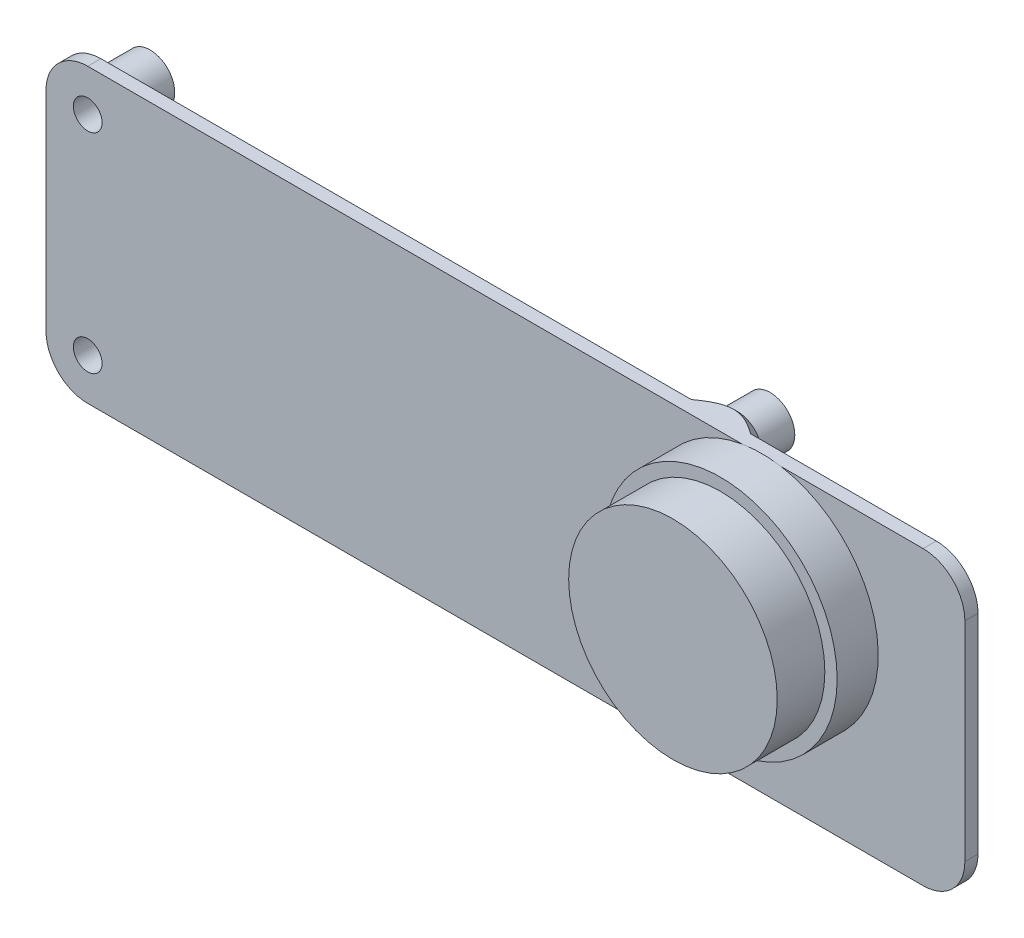
ISO-10303-21;
HEADER;
FILE_DESCRIPTION(('STEP AP214'),'2;1');
FILE_NAME('part.step','',(''),(''),'','','');
FILE_SCHEMA(('AUTOMOTIVE_DESIGN { 1 0 10303 214 1 1 1 1 }'));
ENDSEC;
DATA;
#1=APPLICATION_CONTEXT('core data for automotive mechanical design processes');
#2=APPLICATION_PROTOCOL_DEFINITION('international standard','automotive_design',2000,#1);
#3=PRODUCT_CONTEXT('',#1,'mechanical');
#4=PRODUCT('Part','Part','',(#3));
#5=PRODUCT_RELATED_PRODUCT_CATEGORY('part','',(#4));
#6=PRODUCT_DEFINITION_FORMATION('','',#4);
#7=PRODUCT_DEFINITION_CONTEXT('part definition',#1,'design');
#8=PRODUCT_DEFINITION('design','',#6,#7);
#9=PRODUCT_DEFINITION_SHAPE('','',#8);
#10=(LENGTH_UNIT() NAMED_UNIT(*) SI_UNIT(.MILLI.,.METRE.));
#11=(NAMED_UNIT(*) PLANE_ANGLE_UNIT() SI_UNIT($,.RADIAN.));
#12=(NAMED_UNIT(*) SI_UNIT($,.STERADIAN.) SOLID_ANGLE_UNIT());
#13=UNCERTAINTY_MEASURE_WITH_UNIT(LENGTH_MEASURE(1.E-05),#10,'distance_accuracy_value','');
#14=(GEOMETRIC_REPRESENTATION_CONTEXT(3) GLOBAL_UNCERTAINTY_ASSIGNED_CONTEXT((#13)) GLOBAL_UNIT_ASSIGNED_CONTEXT((#10,
#11,#12)) REPRESENTATION_CONTEXT('',''));
#15=CARTESIAN_POINT('',(0.,0.,0.));
#16=DIRECTION('',(0.,0.,1.));
#17=DIRECTION('',(1.,0.,0.));
#18=AXIS2_PLACEMENT_3D('',#15,#16,#17);
#19=CARTESIAN_POINT('',(0.,-25.4,1.6));
#20=DIRECTION('',(0.,0.,1.));
#21=DIRECTION('',(1.,0.,0.));
#22=AXIS2_PLACEMENT_3D('',#19,#20,#21);
#23=PLANE('',#22);
#24=CARTESIAN_POINT('',(64.33,-27.48,1.6));
#25=DIRECTION('',(0.,0.,1.));
#26=DIRECTION('',(1.,0.,0.));
#27=AXIS2_PLACEMENT_3D('',#24,#25,#26);
#28=CIRCLE('',#27,1.75);
#29=CARTESIAN_POINT('',(66.08,-27.48,1.6));
#30=VERTEX_POINT('',#29);
#31=EDGE_CURVE('E187',#30,#30,#28,.T.);
#32=ORIENTED_EDGE('',*,*,#31,.F.);
#33=EDGE_LOOP('',(#32));
#34=FACE_BOUND('',#33,.T.);
#35=CARTESIAN_POINT('',(0.,-25.4,1.6));
#36=DIRECTION('',(0.,0.,1.));
#37=DIRECTION('',(1.,0.,0.));
#38=AXIS2_PLACEMENT_3D('',#35,#36,#37);
#39=CIRCLE('',#38,1.75);
#40=CARTESIAN_POINT('',(1.75,-25.4,1.6));
#41=VERTEX_POINT('',#40);
#42=EDGE_CURVE('E193',#41,#41,#39,.T.);
#43=ORIENTED_EDGE('',*,*,#42,.F.);
#44=EDGE_LOOP('',(#43));
#45=FACE_BOUND('',#44,.T.);
#46=CARTESIAN_POINT('',(0.,0.,1.6));
#47=DIRECTION('',(0.,0.,1.));
#48=DIRECTION('',(1.,0.,0.));
#49=AXIS2_PLACEMENT_3D('',#46,#47,#48);
#50=CIRCLE('',#49,1.75);
#51=CARTESIAN_POINT('',(1.75,0.,1.6));
#52=VERTEX_POINT('',#51);
#53=EDGE_CURVE('E196',#52,#52,#50,.T.);
#54=ORIENTED_EDGE('',*,*,#53,.F.);
#55=EDGE_LOOP('',(#54));
#56=FACE_BOUND('',#55,.T.);
#57=DIRECTION('',(-1.,0.,0.));
#58=VECTOR('',#57,1.);
#59=CARTESIAN_POINT('',(0.,5.08,1.6));
#60=LINE('',#59,#58);
#61=CARTESIAN_POINT('',(101.74,5.08,1.6));
#62=VERTEX_POINT('',#61);
#63=CARTESIAN_POINT('',(84.4448684174076,5.08,1.6));
#64=VERTEX_POINT('',#63);
#65=EDGE_CURVE('E140',#62,#64,#60,.T.);
#66=ORIENTED_EDGE('',*,*,#65,.T.);
#67=CARTESIAN_POINT('',(82.07,-8.92,1.6));
#68=DIRECTION('',(0.,0.,1.));
#69=DIRECTION('',(1.,0.,0.));
#70=AXIS2_PLACEMENT_3D('',#67,#68,#69);
#71=CIRCLE('',#70,14.2);
#72=CARTESIAN_POINT('',(79.6951315825924,5.08,1.6));
#73=VERTEX_POINT('',#72);
#74=EDGE_CURVE('E144',#73,#64,#71,.T.);
#75=ORIENTED_EDGE('',*,*,#74,.F.);
#76=CARTESIAN_POINT('',(0.,5.08,1.6));
#77=VERTEX_POINT('',#76);
#78=EDGE_CURVE('E129',#73,#77,#60,.T.);
#79=ORIENTED_EDGE('',*,*,#78,.T.);
#80=CARTESIAN_POINT('',(0.,0.,1.6));
#81=DIRECTION('',(0.,0.,1.));
#82=DIRECTION('',(1.,0.,0.));
#83=AXIS2_PLACEMENT_3D('',#80,#81,#82);
#84=CIRCLE('',#83,5.08);
#85=CARTESIAN_POINT('',(-5.08,0.,1.6));
#86=VERTEX_POINT('',#85);
#87=EDGE_CURVE('E211',#77,#86,#84,.T.);
#88=ORIENTED_EDGE('',*,*,#87,.T.);
#89=DIRECTION('',(0.,-1.,0.));
#90=VECTOR('',#89,1.);
#91=CARTESIAN_POINT('',(-5.08,0.,1.6));
#92=LINE('',#91,#90);
#93=CARTESIAN_POINT('',(-5.08,-25.4,1.6));
#94=VERTEX_POINT('',#93);
#95=EDGE_CURVE('E213',#86,#94,#92,.T.);
#96=ORIENTED_EDGE('',*,*,#95,.T.);
#97=CARTESIAN_POINT('',(0.,-25.4,1.6));
#98=DIRECTION('',(0.,0.,1.));
#99=DIRECTION('',(1.,0.,0.));
#100=AXIS2_PLACEMENT_3D('',#97,#98,#99);
#101=CIRCLE('',#100,5.08);
#102=CARTESIAN_POINT('',(0.,-30.48,1.6));
#103=VERTEX_POINT('',#102);
#104=EDGE_CURVE('E200',#94,#103,#101,.T.);
#105=ORIENTED_EDGE('',*,*,#104,.T.);
#106=DIRECTION('',(1.,0.,0.));
#107=VECTOR('',#106,1.);
#108=CARTESIAN_POINT('',(0.,-30.48,1.6));
#109=LINE('',#108,#107);
#110=CARTESIAN_POINT('',(101.74,-30.48,1.6));
#111=VERTEX_POINT('',#110);
#112=EDGE_CURVE('E203',#103,#111,#109,.T.);
#113=ORIENTED_EDGE('',*,*,#112,.T.);
#114=CARTESIAN_POINT('',(101.74,-25.4,1.6));
#115=DIRECTION('',(0.,0.,1.));
#116=DIRECTION('',(1.,0.,0.));
#117=AXIS2_PLACEMENT_3D('',#114,#115,#116);
#118=CIRCLE('',#117,5.08);
#119=CARTESIAN_POINT('',(106.82,-25.4,1.6));
#120=VERTEX_POINT('',#119);
#121=EDGE_CURVE('E206',#111,#120,#118,.T.);
#122=ORIENTED_EDGE('',*,*,#121,.T.);
#123=DIRECTION('',(0.,1.,0.));
#124=VECTOR('',#123,1.);
#125=CARTESIAN_POINT('',(106.82,0.,1.6));
#126=LINE('',#125,#124);
#127=CARTESIAN_POINT('',(106.82,0.,1.6));
#128=VERTEX_POINT('',#127);
#129=EDGE_CURVE('E208',#120,#128,#126,.T.);
#130=ORIENTED_EDGE('',*,*,#129,.T.);
#131=CARTESIAN_POINT('',(101.74,0.,1.6));
#132=DIRECTION('',(0.,0.,1.));
#133=DIRECTION('',(-1.,0.,0.));
#134=AXIS2_PLACEMENT_3D('',#131,#132,#133);
#135=CIRCLE('',#134,5.08);
#136=EDGE_CURVE('E141',#128,#62,#135,.T.);
#137=ORIENTED_EDGE('',*,*,#136,.T.);
#138=EDGE_LOOP('',(#66,#75,#79,#88,#96,#105,#113,#122,#130,#137));
#139=FACE_BOUND('',#138,.T.);
#140=ADVANCED_FACE('F41',(#34,#45,#56,#139),#23,.T.);
#141=CARTESIAN_POINT('',(0.,-25.4,0.));
#142=DIRECTION('',(0.,0.,1.));
#143=DIRECTION('',(1.,0.,0.));
#144=AXIS2_PLACEMENT_3D('',#141,#142,#143);
#145=PLANE('',#144);
#146=CARTESIAN_POINT('',(0.,-25.4,0.));
#147=DIRECTION('',(0.,0.,1.));
#148=DIRECTION('',(1.,0.,0.));
#149=AXIS2_PLACEMENT_3D('',#146,#147,#148);
#150=CIRCLE('',#149,4.99999999999999);
#151=CARTESIAN_POINT('',(4.99999999999999,-25.4,0.));
#152=VERTEX_POINT('',#151);
#153=EDGE_CURVE('E263',#152,#152,#150,.T.);
#154=ORIENTED_EDGE('',*,*,#153,.T.);
#155=EDGE_LOOP('',(#154));
#156=FACE_BOUND('',#155,.T.);
#157=CARTESIAN_POINT('',(0.,0.,0.));
#158=DIRECTION('',(0.,0.,1.));
#159=DIRECTION('',(1.,0.,0.));
#160=AXIS2_PLACEMENT_3D('',#157,#158,#159);
#161=CIRCLE('',#160,5.);
#162=CARTESIAN_POINT('',(5.,0.,0.));
#163=VERTEX_POINT('',#162);
#164=EDGE_CURVE('E260',#163,#163,#161,.T.);
#165=ORIENTED_EDGE('',*,*,#164,.T.);
#166=EDGE_LOOP('',(#165));
#167=FACE_BOUND('',#166,.T.);
#168=DIRECTION('',(1.,0.,0.));
#169=VECTOR('',#168,1.);
#170=CARTESIAN_POINT('',(0.,-30.48,0.));
#171=LINE('',#170,#169);
#172=CARTESIAN_POINT('',(68.33,-30.48,0.));
#173=VERTEX_POINT('',#172);
#174=CARTESIAN_POINT('',(101.74,-30.48,0.));
#175=VERTEX_POINT('',#174);
#176=EDGE_CURVE('E218',#173,#175,#171,.T.);
#177=ORIENTED_EDGE('',*,*,#176,.F.);
#178=CARTESIAN_POINT('',(64.33,-27.48,0.));
#179=DIRECTION('',(0.,0.,1.));
#180=DIRECTION('',(1.,0.,0.));
#181=AXIS2_PLACEMENT_3D('',#178,#179,#180);
#182=CIRCLE('',#181,4.99999999999999);
#183=CARTESIAN_POINT('',(60.33,-30.48,0.));
#184=VERTEX_POINT('',#183);
#185=EDGE_CURVE('E266',#173,#184,#182,.T.);
#186=ORIENTED_EDGE('',*,*,#185,.T.);
#187=CARTESIAN_POINT('',(0.,-30.48,0.));
#188=VERTEX_POINT('',#187);
#189=EDGE_CURVE('E219',#188,#184,#171,.T.);
#190=ORIENTED_EDGE('',*,*,#189,.F.);
#191=CARTESIAN_POINT('',(0.,-25.4,0.));
#192=DIRECTION('',(0.,0.,1.));
#193=DIRECTION('',(1.,0.,0.));
#194=AXIS2_PLACEMENT_3D('',#191,#192,#193);
#195=CIRCLE('',#194,5.08);
#196=CARTESIAN_POINT('',(-5.08,-25.4,0.));
#197=VERTEX_POINT('',#196);
#198=EDGE_CURVE('E199',#197,#188,#195,.T.);
#199=ORIENTED_EDGE('',*,*,#198,.F.);
#200=DIRECTION('',(0.,-1.,0.));
#201=VECTOR('',#200,1.);
#202=CARTESIAN_POINT('',(-5.08,0.,0.));
#203=LINE('',#202,#201);
#204=CARTESIAN_POINT('',(-5.08,0.,0.));
#205=VERTEX_POINT('',#204);
#206=EDGE_CURVE('E204',#205,#197,#203,.T.);
#207=ORIENTED_EDGE('',*,*,#206,.F.);
#208=CARTESIAN_POINT('',(0.,0.,0.));
#209=DIRECTION('',(0.,0.,1.));
#210=DIRECTION('',(1.,0.,0.));
#211=AXIS2_PLACEMENT_3D('',#208,#209,#210);
#212=CIRCLE('',#211,5.08);
#213=CARTESIAN_POINT('',(0.,5.08,0.));
#214=VERTEX_POINT('',#213);
#215=EDGE_CURVE('E230',#214,#205,#212,.T.);
#216=ORIENTED_EDGE('',*,*,#215,.F.);
#217=DIRECTION('',(-1.,0.,0.));
#218=VECTOR('',#217,1.);
#219=CARTESIAN_POINT('',(0.,5.08,0.));
#220=LINE('',#219,#218);
#221=CARTESIAN_POINT('',(71.8909531641605,5.08,0.));
#222=VERTEX_POINT('',#221);
#223=EDGE_CURVE('E227',#222,#214,#220,.T.);
#224=ORIENTED_EDGE('',*,*,#223,.F.);
#225=CARTESIAN_POINT('',(75.51,1.63,0.));
#226=DIRECTION('',(0.,0.,1.));
#227=DIRECTION('',(1.,0.,0.));
#228=AXIS2_PLACEMENT_3D('',#225,#226,#227);
#229=CIRCLE('',#228,4.99999999999999);
#230=CARTESIAN_POINT('',(79.1290468358395,5.08,0.));
#231=VERTEX_POINT('',#230);
#232=EDGE_CURVE('E257',#222,#231,#229,.T.);
#233=ORIENTED_EDGE('',*,*,#232,.T.);
#234=CARTESIAN_POINT('',(101.74,5.08,0.));
#235=VERTEX_POINT('',#234);
#236=EDGE_CURVE('E228',#235,#231,#220,.T.);
#237=ORIENTED_EDGE('',*,*,#236,.F.);
#238=CARTESIAN_POINT('',(101.74,0.,0.));
#239=DIRECTION('',(0.,0.,1.));
#240=DIRECTION('',(-1.,0.,0.));
#241=AXIS2_PLACEMENT_3D('',#238,#239,#240);
#242=CIRCLE('',#241,5.08);
#243=CARTESIAN_POINT('',(106.82,0.,0.));
#244=VERTEX_POINT('',#243);
#245=EDGE_CURVE('E225',#244,#235,#242,.T.);
#246=ORIENTED_EDGE('',*,*,#245,.F.);
#247=DIRECTION('',(0.,1.,0.));
#248=VECTOR('',#247,1.);
#249=CARTESIAN_POINT('',(106.82,0.,0.));
#250=LINE('',#249,#248);
#251=CARTESIAN_POINT('',(106.82,-25.4,0.));
#252=VERTEX_POINT('',#251);
#253=EDGE_CURVE('E223',#252,#244,#250,.T.);
#254=ORIENTED_EDGE('',*,*,#253,.F.);
#255=CARTESIAN_POINT('',(101.74,-25.4,0.));
#256=DIRECTION('',(0.,0.,1.));
#257=DIRECTION('',(1.,0.,0.));
#258=AXIS2_PLACEMENT_3D('',#255,#256,#257);
#259=CIRCLE('',#258,5.08);
#260=EDGE_CURVE('E221',#175,#252,#259,.T.);
#261=ORIENTED_EDGE('',*,*,#260,.F.);
#262=EDGE_LOOP('',(#177,#186,#190,#199,#207,#216,#224,#233,#237,#246,#254,#261));
#263=FACE_BOUND('',#262,.T.);
#264=ADVANCED_FACE('F323',(#156,#167,#263),#145,.F.);
#265=CARTESIAN_POINT('',(0.,-25.4,1.6));
#266=DIRECTION('',(0.,0.,-1.));
#267=DIRECTION('',(-1.,0.,0.));
#268=AXIS2_PLACEMENT_3D('',#265,#266,#267);
#269=CYLINDRICAL_SURFACE('',#268,5.08);
#270=ORIENTED_EDGE('',*,*,#198,.T.);
#271=DIRECTION('',(0.,0.,-1.));
#272=VECTOR('',#271,1.);
#273=CARTESIAN_POINT('',(0.,-30.48,1.6));
#274=LINE('',#273,#272);
#275=EDGE_CURVE('E251',#103,#188,#274,.T.);
#276=ORIENTED_EDGE('',*,*,#275,.F.);
#277=ORIENTED_EDGE('',*,*,#104,.F.);
#278=DIRECTION('',(0.,0.,-1.));
#279=VECTOR('',#278,1.);
#280=CARTESIAN_POINT('',(-5.08,-25.4,1.6));
#281=LINE('',#280,#279);
#282=EDGE_CURVE('E215',#94,#197,#281,.T.);
#283=ORIENTED_EDGE('',*,*,#282,.T.);
#284=EDGE_LOOP('',(#270,#276,#277,#283));
#285=FACE_BOUND('',#284,.T.);
#286=ADVANCED_FACE('F304',(#285),#269,.T.);
#287=CARTESIAN_POINT('',(0.,-30.48,1.6));
#288=DIRECTION('',(0.,1.,0.));
#289=DIRECTION('',(0.,0.,1.));
#290=AXIS2_PLACEMENT_3D('',#287,#288,#289);
#291=PLANE('',#290);
#292=ORIENTED_EDGE('',*,*,#189,.T.);
#293=CARTESIAN_POINT('',(60.33,-30.48,0.));
#294=CARTESIAN_POINT('',(60.4042045666358,-30.48,-0.0593600465069753));
#295=CARTESIAN_POINT('',(60.4786951441885,-30.48,-0.118362128846301));
#296=CARTESIAN_POINT('',(60.6283359131911,-30.48,-0.235532965714645));
#297=CARTESIAN_POINT('',(60.7034861450909,-30.48,-0.293701668556894));
#298=CARTESIAN_POINT('',(60.9303044347763,-30.48,-0.466969643006251));
#299=CARTESIAN_POINT('',(61.0830846810868,-30.48,-0.580625166081469));
#300=CARTESIAN_POINT('',(61.3978855060882,-30.48,-0.806570760726502));
#301=CARTESIAN_POINT('',(61.5600421027586,-30.48,-0.91867231134009));
#302=CARTESIAN_POINT('',(61.8895973852149,-30.48,-1.13476511479384));
#303=CARTESIAN_POINT('',(62.05699221458,-30.48,-1.23876214611068));
#304=CARTESIAN_POINT('',(62.3330604091188,-30.48,-1.3971694347975));
#305=CARTESIAN_POINT('',(62.4395984344024,-30.48,-1.45528558907362));
#306=CARTESIAN_POINT('',(62.6557285649442,-30.48,-1.56568198582262));
#307=CARTESIAN_POINT('',(62.7653215190622,-30.48,-1.61796058562693));
#308=CARTESIAN_POINT('',(62.9864202954857,-30.48,-1.7143588600513));
#309=CARTESIAN_POINT('',(63.0978842075391,-30.48,-1.75857363454419));
#310=CARTESIAN_POINT('',(63.3240547037457,-30.48,-1.83760583606441));
#311=CARTESIAN_POINT('',(63.4387579611664,-30.48,-1.87243254259444));
#312=CARTESIAN_POINT('',(63.6178403889869,-30.48,-1.917233062674));
#313=CARTESIAN_POINT('',(63.6812103898271,-30.48,-1.93128449976482));
#314=CARTESIAN_POINT('',(63.8086539853925,-30.48,-1.95567882607544));
#315=CARTESIAN_POINT('',(63.8727274161421,-30.48,-1.96602256143755));
#316=CARTESIAN_POINT('',(64.0021656255051,-30.48,-1.98282939929949));
#317=CARTESIAN_POINT('',(64.0675366807644,-30.48,-1.98924456364397));
#318=CARTESIAN_POINT('',(64.1986018968021,-30.48,-1.99784210181405));
#319=CARTESIAN_POINT('',(64.264296254929,-30.48,-2.00002145058361));
#320=CARTESIAN_POINT('',(64.33,-30.48,-2.00000000000002));
#321=B_SPLINE_CURVE_WITH_KNOTS('',3,(#293,#294,#295,#296,#297,#298,#299,#300,#301,#302,#303,
#304,#305,#306,#307,#308,#309,#310,#311,#312,#313,#314,#315,#316,#317,#318,#319,#320),
.UNSPECIFIED.,.F.,.F.,(4,2,2,2,2,2,2,2,2,2,2,2,2,4),(0.,0.285075346497055,0.570168297685432,
1.14133762065735,1.73258973397109,2.32341635583755,2.6873570090875,3.05139981731677,
3.41082388918195,3.76989137977573,3.9645257221408,4.1591156182755,4.3560349873879,
4.55309493711647),.UNSPECIFIED.);
#322=CARTESIAN_POINT('',(64.33,-30.48,-2.00000000000002));
#323=VERTEX_POINT('',#322);
#324=EDGE_CURVE('E56',#184,#323,#321,.T.);
#325=ORIENTED_EDGE('',*,*,#324,.T.);
#326=CARTESIAN_POINT('',(64.33,-30.48,-2.00000000000002));
#327=CARTESIAN_POINT('',(64.3761354149615,-30.48,-2.00000371177859));
#328=CARTESIAN_POINT('',(64.4222640277094,-30.48,-1.99893522458333));
#329=CARTESIAN_POINT('',(64.5144166806191,-30.48,-1.99468881207754));
#330=CARTESIAN_POINT('',(64.5604407367487,-30.48,-1.99151123412403));
#331=CARTESIAN_POINT('',(64.6980364575231,-30.48,-1.97888565339324));
#332=CARTESIAN_POINT('',(64.7893392979656,-30.48,-1.96634448765126));
#333=CARTESIAN_POINT('',(64.9689770689493,-30.48,-1.93395904526895));
#334=CARTESIAN_POINT('',(65.0573360217277,-30.48,-1.91424472614783));
#335=CARTESIAN_POINT('',(65.2323840019678,-30.48,-1.86836133852704));
#336=CARTESIAN_POINT('',(65.3190722051613,-30.48,-1.84218916768549));
#337=CARTESIAN_POINT('',(65.5929254358614,-30.48,-1.74983489322469));
#338=CARTESIAN_POINT('',(65.7765592477129,-30.48,-1.67317492159161));
#339=CARTESIAN_POINT('',(66.1354420774485,-30.48,-1.50219964965461));
#340=CARTESIAN_POINT('',(66.3106744884321,-30.48,-1.40785105635736));
#341=CARTESIAN_POINT('',(66.6568100950514,-30.48,-1.20605249188957));
#342=CARTESIAN_POINT('',(66.8276110962395,-30.48,-1.09842956922804));
#343=CARTESIAN_POINT('',(67.1636564132451,-30.48,-0.875213025888325));
#344=CARTESIAN_POINT('',(67.3289049221925,-30.48,-0.759625630668685));
#345=CARTESIAN_POINT('',(67.6355351707639,-30.48,-0.537169784425063));
#346=CARTESIAN_POINT('',(67.777383854367,-30.48,-0.430940484488483));
#347=CARTESIAN_POINT('',(67.9872151969223,-30.48,-0.269962000951696));
#348=CARTESIAN_POINT('',(68.05615045823,-30.48,-0.216446991968315));
#349=CARTESIAN_POINT('',(68.1934710548399,-30.48,-0.108722016700328));
#350=CARTESIAN_POINT('',(68.2618564147369,-30.48,-0.0545120817814854));
#351=CARTESIAN_POINT('',(68.33,-30.48,0.));
#352=B_SPLINE_CURVE_WITH_KNOTS('',3,(#326,#327,#328,#329,#330,#331,#332,#333,#334,#335,#336,
#337,#338,#339,#340,#341,#342,#343,#344,#345,#346,#347,#348,#349,#350,#351),.UNSPECIFIED.,.F.,
.F.,(4,2,2,2,2,2,2,2,2,2,2,2,4),(0.,0.138380878645855,0.276738972285148,0.552834640213549,
0.824158840019247,1.09561363818839,1.69096802813075,2.28745443526049,2.89275248259271,
3.49758264932597,4.02917096400334,4.29097525092169,4.55276776251418),.UNSPECIFIED.);
#353=EDGE_CURVE('E278',#323,#173,#352,.T.);
#354=ORIENTED_EDGE('',*,*,#353,.T.);
#355=ORIENTED_EDGE('',*,*,#176,.T.);
#356=DIRECTION('',(0.,0.,-1.));
#357=VECTOR('',#356,1.);
#358=CARTESIAN_POINT('',(101.74,-30.48,1.6));
#359=LINE('',#358,#357);
#360=EDGE_CURVE('E248',#111,#175,#359,.T.);
#361=ORIENTED_EDGE('',*,*,#360,.F.);
#362=ORIENTED_EDGE('',*,*,#112,.F.);
#363=ORIENTED_EDGE('',*,*,#275,.T.);
#364=EDGE_LOOP('',(#292,#325,#354,#355,#361,#362,#363));
#365=FACE_BOUND('',#364,.T.);
#366=ADVANCED_FACE('F289',(#365),#291,.F.);
#367=CARTESIAN_POINT('',(101.74,-25.4,1.6));
#368=DIRECTION('',(0.,0.,-1.));
#369=DIRECTION('',(-1.,0.,0.));
#370=AXIS2_PLACEMENT_3D('',#367,#368,#369);
#371=CYLINDRICAL_SURFACE('',#370,5.08);
#372=ORIENTED_EDGE('',*,*,#260,.T.);
#373=DIRECTION('',(0.,0.,-1.));
#374=VECTOR('',#373,1.);
#375=CARTESIAN_POINT('',(106.82,-25.4,1.6));
#376=LINE('',#375,#374);
#377=EDGE_CURVE('E245',#120,#252,#376,.T.);
#378=ORIENTED_EDGE('',*,*,#377,.F.);
#379=ORIENTED_EDGE('',*,*,#121,.F.);
#380=ORIENTED_EDGE('',*,*,#360,.T.);
#381=EDGE_LOOP('',(#372,#378,#379,#380));
#382=FACE_BOUND('',#381,.T.);
#383=ADVANCED_FACE('F355',(#382),#371,.T.);
#384=CARTESIAN_POINT('',(106.82,0.,1.6));
#385=DIRECTION('',(-1.,0.,0.));
#386=DIRECTION('',(0.,0.,1.));
#387=AXIS2_PLACEMENT_3D('',#384,#385,#386);
#388=PLANE('',#387);
#389=ORIENTED_EDGE('',*,*,#253,.T.);
#390=DIRECTION('',(0.,0.,-1.));
#391=VECTOR('',#390,1.);
#392=CARTESIAN_POINT('',(106.82,0.,1.6));
#393=LINE('',#392,#391);
#394=EDGE_CURVE('E242',#128,#244,#393,.T.);
#395=ORIENTED_EDGE('',*,*,#394,.F.);
#396=ORIENTED_EDGE('',*,*,#129,.F.);
#397=ORIENTED_EDGE('',*,*,#377,.T.);
#398=EDGE_LOOP('',(#389,#395,#396,#397));
#399=FACE_BOUND('',#398,.T.);
#400=ADVANCED_FACE('F352',(#399),#388,.F.);
#401=CARTESIAN_POINT('',(101.74,0.,1.6));
#402=DIRECTION('',(0.,0.,-1.));
#403=DIRECTION('',(-1.,0.,0.));
#404=AXIS2_PLACEMENT_3D('',#401,#402,#403);
#405=CYLINDRICAL_SURFACE('',#404,5.08);
#406=ORIENTED_EDGE('',*,*,#245,.T.);
#407=DIRECTION('',(0.,0.,-1.));
#408=VECTOR('',#407,1.);
#409=CARTESIAN_POINT('',(101.74,5.08,1.6));
#410=LINE('',#409,#408);
#411=EDGE_CURVE('E239',#62,#235,#410,.T.);
#412=ORIENTED_EDGE('',*,*,#411,.F.);
#413=ORIENTED_EDGE('',*,*,#136,.F.);
#414=ORIENTED_EDGE('',*,*,#394,.T.);
#415=EDGE_LOOP('',(#406,#412,#413,#414));
#416=FACE_BOUND('',#415,.T.);
#417=ADVANCED_FACE('F349',(#416),#405,.T.);
#418=CARTESIAN_POINT('',(0.,5.08,1.6));
#419=DIRECTION('',(0.,-1.,0.));
#420=DIRECTION('',(0.,0.,-1.));
#421=AXIS2_PLACEMENT_3D('',#418,#419,#420);
#422=PLANE('',#421);
#423=ORIENTED_EDGE('',*,*,#236,.T.);
#424=CARTESIAN_POINT('',(79.1290468358395,5.08,0.));
#425=CARTESIAN_POINT('',(79.0315945067503,5.08,-0.0705157232223393));
#426=CARTESIAN_POINT('',(78.9335090841336,5.08,-0.140174208744895));
#427=CARTESIAN_POINT('',(78.7358115203641,5.08,-0.277369715557429));
#428=CARTESIAN_POINT('',(78.6361988035316,5.08,-0.344905906113015));
#429=CARTESIAN_POINT('',(78.4341140156061,5.08,-0.478150989252596));
#430=CARTESIAN_POINT('',(78.3316222831519,5.08,-0.543830213949148));
#431=CARTESIAN_POINT('',(78.1246329458006,5.08,-0.671929869406897));
#432=CARTESIAN_POINT('',(78.0201355451997,5.08,-0.734350629689198));
#433=CARTESIAN_POINT('',(77.8044893759145,5.08,-0.857652689868404));
#434=CARTESIAN_POINT('',(77.6932434437955,5.08,-0.918366351637153));
#435=CARTESIAN_POINT('',(77.46794240831,5.08,-1.03430985365339));
#436=CARTESIAN_POINT('',(77.3538867645616,5.08,-1.089538628572));
#437=CARTESIAN_POINT('',(77.0080149202814,5.08,-1.24444226102224));
#438=CARTESIAN_POINT('',(76.7713002242767,5.08,-1.33404997933809));
#439=CARTESIAN_POINT('',(76.4146899482032,5.08,-1.43502698879264));
#440=CARTESIAN_POINT('',(76.2993756982636,5.08,-1.46269155059348));
#441=CARTESIAN_POINT('',(76.06661487289,5.08,-1.50725221824941));
#442=CARTESIAN_POINT('',(75.9491680268961,5.08,-1.52414694779213));
#443=CARTESIAN_POINT('',(75.7150346342493,5.08,-1.54584632026062));
#444=CARTESIAN_POINT('',(75.5983658048573,5.08,-1.55083936758045));
#445=CARTESIAN_POINT('',(75.3651282708847,5.08,-1.54892926532315));
#446=CARTESIAN_POINT('',(75.2485595643313,5.08,-1.54202635580252));
#447=CARTESIAN_POINT('',(75.0172036367805,5.08,-1.51687337115469));
#448=CARTESIAN_POINT('',(74.9024107972705,5.08,-1.49867391616871));
#449=CARTESIAN_POINT('',(74.6749210471169,5.08,-1.45212106466187));
#450=CARTESIAN_POINT('',(74.562224473434,5.08,-1.42376605028919));
#451=CARTESIAN_POINT('',(74.3377112434929,5.08,-1.35787752204195));
#452=CARTESIAN_POINT('',(74.2259343503218,5.08,-1.32021036995785));
#453=CARTESIAN_POINT('',(74.0051892646719,5.08,-1.23748948224965));
#454=CARTESIAN_POINT('',(73.8962210094665,5.08,-1.19243591175528));
#455=CARTESIAN_POINT('',(73.6164291067043,5.08,-1.06753022851015));
#456=CARTESIAN_POINT('',(73.4476970566075,5.08,-0.983011640270327));
#457=CARTESIAN_POINT('',(73.1160423313302,5.08,-0.803081941345173));
#458=CARTESIAN_POINT('',(72.9531261398184,5.08,-0.707659143228296));
#459=CARTESIAN_POINT('',(72.6382185456412,5.08,-0.51280360496077));
#460=CARTESIAN_POINT('',(72.486047075208,5.08,-0.413659648976501));
#461=CARTESIAN_POINT('',(72.2607245292928,5.08,-0.261090477235211));
#462=CARTESIAN_POINT('',(72.1862046627797,5.08,-0.209663825652991));
#463=CARTESIAN_POINT('',(72.037987612292,5.08,-0.10565741709452));
#464=CARTESIAN_POINT('',(71.9642903244801,5.08,-0.0530778082026191));
#465=CARTESIAN_POINT('',(71.8909531641605,5.08,0.));
#466=B_SPLINE_CURVE_WITH_KNOTS('',3,(#424,#425,#426,#427,#428,#429,#430,#431,#432,#433,#434,
#435,#436,#437,#438,#439,#440,#441,#442,#443,#444,#445,#446,#447,#448,#449,#450,#451,#452,#453,
#454,#455,#456,#457,#458,#459,#460,#461,#462,#463,#464,#465),.UNSPECIFIED.,.F.,.F.,(4,2,2,2,2,2,
2,2,2,2,2,2,2,2,2,2,2,2,2,2,4),(0.,0.360877232941856,0.721894008426871,1.08703277243548,
1.45213453897024,1.83218303421761,2.21230520245886,2.96839101639909,3.32373836173002,
3.67913110897113,4.02885947769452,4.37858078909719,4.72674619136643,5.07496708351434,
5.42850925259039,5.78204351900574,6.34757648265183,6.91372138835516,7.45842244159258,
7.73004126825074,8.00162541054475),.UNSPECIFIED.);
#467=EDGE_CURVE('E11',#231,#222,#466,.T.);
#468=ORIENTED_EDGE('',*,*,#467,.T.);
#469=ORIENTED_EDGE('',*,*,#223,.T.);
#470=DIRECTION('',(0.,0.,-1.));
#471=VECTOR('',#470,1.);
#472=CARTESIAN_POINT('',(0.,5.08,1.6));
#473=LINE('',#472,#471);
#474=EDGE_CURVE('E137',#77,#214,#473,.T.);
#475=ORIENTED_EDGE('',*,*,#474,.F.);
#476=ORIENTED_EDGE('',*,*,#78,.F.);
#477=DIRECTION('',(-1.,0.,0.));
#478=VECTOR('',#477,1.);
#479=CARTESIAN_POINT('',(0.,5.08,1.6));
#480=LINE('',#479,#478);
#481=EDGE_CURVE('E134',#64,#73,#480,.T.);
#482=ORIENTED_EDGE('',*,*,#481,.F.);
#483=ORIENTED_EDGE('',*,*,#65,.F.);
#484=ORIENTED_EDGE('',*,*,#411,.T.);
#485=EDGE_LOOP('',(#423,#468,#469,#475,#476,#482,#483,#484));
#486=FACE_BOUND('',#485,.T.);
#487=ADVANCED_FACE('F131',(#486),#422,.F.);
#488=CARTESIAN_POINT('',(0.,0.,1.6));
#489=DIRECTION('',(0.,0.,-1.));
#490=DIRECTION('',(-1.,0.,0.));
#491=AXIS2_PLACEMENT_3D('',#488,#489,#490);
#492=CYLINDRICAL_SURFACE('',#491,5.08);
#493=ORIENTED_EDGE('',*,*,#215,.T.);
#494=DIRECTION('',(0.,0.,-1.));
#495=VECTOR('',#494,1.);
#496=CARTESIAN_POINT('',(-5.08,0.,1.6));
#497=LINE('',#496,#495);
#498=EDGE_CURVE('E235',#86,#205,#497,.T.);
#499=ORIENTED_EDGE('',*,*,#498,.F.);
#500=ORIENTED_EDGE('',*,*,#87,.F.);
#501=ORIENTED_EDGE('',*,*,#474,.T.);
#502=EDGE_LOOP('',(#493,#499,#500,#501));
#503=FACE_BOUND('',#502,.T.);
#504=ADVANCED_FACE('F342',(#503),#492,.T.);
#505=CARTESIAN_POINT('',(-5.08,0.,1.6));
#506=DIRECTION('',(1.,0.,0.));
#507=DIRECTION('',(0.,1.,0.));
#508=AXIS2_PLACEMENT_3D('',#505,#506,#507);
#509=PLANE('',#508);
#510=ORIENTED_EDGE('',*,*,#206,.T.);
#511=ORIENTED_EDGE('',*,*,#282,.F.);
#512=ORIENTED_EDGE('',*,*,#95,.F.);
#513=ORIENTED_EDGE('',*,*,#498,.T.);
#514=EDGE_LOOP('',(#510,#511,#512,#513));
#515=FACE_BOUND('',#514,.T.);
#516=ADVANCED_FACE('F339',(#515),#509,.F.);
#517=CARTESIAN_POINT('',(0.,0.,1.6));
#518=DIRECTION('',(0.,0.,-1.));
#519=DIRECTION('',(-1.,0.,0.));
#520=AXIS2_PLACEMENT_3D('',#517,#518,#519);
#521=CYLINDRICAL_SURFACE('',#520,1.75);
#522=ORIENTED_EDGE('',*,*,#53,.T.);
#523=EDGE_LOOP('',(#522));
#524=FACE_BOUND('',#523,.T.);
#525=CARTESIAN_POINT('',(0.,0.,-6.));
#526=DIRECTION('',(0.,0.,-1.));
#527=DIRECTION('',(-1.,0.,0.));
#528=AXIS2_PLACEMENT_3D('',#525,#526,#527);
#529=CIRCLE('',#528,1.75);
#530=CARTESIAN_POINT('',(-1.75,0.,-6.));
#531=VERTEX_POINT('',#530);
#532=EDGE_CURVE('E163',#531,#531,#529,.T.);
#533=ORIENTED_EDGE('',*,*,#532,.T.);
#534=EDGE_LOOP('',(#533));
#535=FACE_BOUND('',#534,.T.);
#536=ADVANCED_FACE('F336',(#524,#535),#521,.F.);
#537=CARTESIAN_POINT('',(0.,-25.4,1.6));
#538=DIRECTION('',(0.,0.,-1.));
#539=DIRECTION('',(-1.,0.,0.));
#540=AXIS2_PLACEMENT_3D('',#537,#538,#539);
#541=CYLINDRICAL_SURFACE('',#540,1.75);
#542=ORIENTED_EDGE('',*,*,#42,.T.);
#543=EDGE_LOOP('',(#542));
#544=FACE_BOUND('',#543,.T.);
#545=CARTESIAN_POINT('',(0.,-25.4,-6.));
#546=DIRECTION('',(0.,0.,-1.));
#547=DIRECTION('',(-1.,0.,0.));
#548=AXIS2_PLACEMENT_3D('',#545,#546,#547);
#549=CIRCLE('',#548,1.75);
#550=CARTESIAN_POINT('',(-1.75,-25.4,-6.));
#551=VERTEX_POINT('',#550);
#552=EDGE_CURVE('E169',#551,#551,#549,.T.);
#553=ORIENTED_EDGE('',*,*,#552,.T.);
#554=EDGE_LOOP('',(#553));
#555=FACE_BOUND('',#554,.T.);
#556=ADVANCED_FACE('F409',(#544,#555),#541,.F.);
#557=CARTESIAN_POINT('',(75.51,1.63,1.6));
#558=DIRECTION('',(0.,0.,-1.));
#559=DIRECTION('',(-1.,0.,0.));
#560=AXIS2_PLACEMENT_3D('',#557,#558,#559);
#561=CYLINDRICAL_SURFACE('',#560,1.75);
#562=CARTESIAN_POINT('',(75.51,1.63,1.6));
#563=DIRECTION('',(0.,0.,1.));
#564=DIRECTION('',(1.,0.,0.));
#565=AXIS2_PLACEMENT_3D('',#562,#563,#564);
#566=CIRCLE('',#565,1.75);
#567=CARTESIAN_POINT('',(77.26,1.63,1.6));
#568=VERTEX_POINT('',#567);
#569=EDGE_CURVE('E190',#568,#568,#566,.T.);
#570=ORIENTED_EDGE('',*,*,#569,.T.);
#571=EDGE_LOOP('',(#570));
#572=FACE_BOUND('',#571,.T.);
#573=CARTESIAN_POINT('',(75.51,1.63,-6.));
#574=DIRECTION('',(0.,0.,-1.));
#575=DIRECTION('',(-1.,0.,0.));
#576=AXIS2_PLACEMENT_3D('',#573,#574,#575);
#577=CIRCLE('',#576,1.75);
#578=CARTESIAN_POINT('',(73.76,1.63,-6.));
#579=VERTEX_POINT('',#578);
#580=EDGE_CURVE('E178',#579,#579,#577,.T.);
#581=ORIENTED_EDGE('',*,*,#580,.T.);
#582=EDGE_LOOP('',(#581));
#583=FACE_BOUND('',#582,.T.);
#584=ADVANCED_FACE('F398',(#572,#583),#561,.F.);
#585=CARTESIAN_POINT('',(64.33,-27.48,1.6));
#586=DIRECTION('',(0.,0.,-1.));
#587=DIRECTION('',(-1.,0.,0.));
#588=AXIS2_PLACEMENT_3D('',#585,#586,#587);
#589=CYLINDRICAL_SURFACE('',#588,1.75);
#590=ORIENTED_EDGE('',*,*,#31,.T.);
#591=EDGE_LOOP('',(#590));
#592=FACE_BOUND('',#591,.T.);
#593=CARTESIAN_POINT('',(64.33,-27.48,-6.));
#594=DIRECTION('',(0.,0.,-1.));
#595=DIRECTION('',(-1.,0.,0.));
#596=AXIS2_PLACEMENT_3D('',#593,#594,#595);
#597=CIRCLE('',#596,1.75);
#598=CARTESIAN_POINT('',(62.58,-27.48,-6.));
#599=VERTEX_POINT('',#598);
#600=EDGE_CURVE('E175',#599,#599,#597,.T.);
#601=ORIENTED_EDGE('',*,*,#600,.T.);
#602=EDGE_LOOP('',(#601));
#603=FACE_BOUND('',#602,.T.);
#604=ADVANCED_FACE('F395',(#592,#603),#589,.F.);
#605=CARTESIAN_POINT('',(82.07,-8.92,1.6));
#606=DIRECTION('',(0.,0.,1.));
#607=DIRECTION('',(1.,0.,0.));
#608=AXIS2_PLACEMENT_3D('',#605,#606,#607);
#609=PLANE('',#608);
#610=ORIENTED_EDGE('',*,*,#569,.F.);
#611=EDGE_LOOP('',(#610));
#612=FACE_BOUND('',#611,.T.);
#613=ADVANCED_FACE('F397',(#612),#609,.F.);
#614=CARTESIAN_POINT('',(75.51,1.63,-6.));
#615=DIRECTION('',(0.,0.,-1.));
#616=DIRECTION('',(-1.,0.,0.));
#617=AXIS2_PLACEMENT_3D('',#614,#615,#616);
#618=PLANE('',#617);
#619=CARTESIAN_POINT('',(75.51,1.63,-6.));
#620=DIRECTION('',(0.,0.,-1.));
#621=DIRECTION('',(-1.,0.,0.));
#622=AXIS2_PLACEMENT_3D('',#619,#620,#621);
#623=CIRCLE('',#622,3.00000000000001);
#624=CARTESIAN_POINT('',(72.51,1.63,-6.));
#625=VERTEX_POINT('',#624);
#626=EDGE_CURVE('E181',#625,#625,#623,.T.);
#627=ORIENTED_EDGE('',*,*,#626,.T.);
#628=EDGE_LOOP('',(#627));
#629=FACE_BOUND('',#628,.T.);
#630=ORIENTED_EDGE('',*,*,#580,.F.);
#631=EDGE_LOOP('',(#630));
#632=FACE_BOUND('',#631,.T.);
#633=ADVANCED_FACE('F406',(#629,#632),#618,.T.);
#634=CARTESIAN_POINT('',(75.51,1.63,-6.));
#635=DIRECTION('',(0.,0.,1.));
#636=DIRECTION('',(1.,0.,0.));
#637=AXIS2_PLACEMENT_3D('',#634,#635,#636);
#638=CYLINDRICAL_SURFACE('',#637,3.00000000000001);
#639=CARTESIAN_POINT('',(75.51,1.63,-2.00000000000001));
#640=DIRECTION('',(0.,0.,1.));
#641=DIRECTION('',(1.,0.,0.));
#642=AXIS2_PLACEMENT_3D('',#639,#640,#641);
#643=CIRCLE('',#642,3.00000000000001);
#644=CARTESIAN_POINT('',(78.51,1.63,-2.00000000000001));
#645=VERTEX_POINT('',#644);
#646=EDGE_CURVE('E275',#645,#645,#643,.F.);
#647=ORIENTED_EDGE('',*,*,#646,.T.);
#648=EDGE_LOOP('',(#647));
#649=FACE_BOUND('',#648,.T.);
#650=ORIENTED_EDGE('',*,*,#626,.F.);
#651=EDGE_LOOP('',(#650));
#652=FACE_BOUND('',#651,.T.);
#653=ADVANCED_FACE('F391',(#649,#652),#638,.T.);
#654=CARTESIAN_POINT('',(64.33,-27.48,-6.));
#655=DIRECTION('',(0.,0.,-1.));
#656=DIRECTION('',(-1.,0.,0.));
#657=AXIS2_PLACEMENT_3D('',#654,#655,#656);
#658=PLANE('',#657);
#659=CARTESIAN_POINT('',(64.33,-27.48,-6.));
#660=DIRECTION('',(0.,0.,-1.));
#661=DIRECTION('',(-1.,0.,0.));
#662=AXIS2_PLACEMENT_3D('',#659,#660,#661);
#663=CIRCLE('',#662,3.);
#664=CARTESIAN_POINT('',(61.33,-27.48,-6.));
#665=VERTEX_POINT('',#664);
#666=EDGE_CURVE('E172',#665,#665,#663,.T.);
#667=ORIENTED_EDGE('',*,*,#666,.T.);
#668=EDGE_LOOP('',(#667));
#669=FACE_BOUND('',#668,.T.);
#670=ORIENTED_EDGE('',*,*,#600,.F.);
#671=EDGE_LOOP('',(#670));
#672=FACE_BOUND('',#671,.T.);
#673=ADVANCED_FACE('F385',(#669,#672),#658,.T.);
#674=CARTESIAN_POINT('',(64.33,-27.48,-6.));
#675=DIRECTION('',(0.,0.,1.));
#676=DIRECTION('',(1.,0.,0.));
#677=AXIS2_PLACEMENT_3D('',#674,#675,#676);
#678=CYLINDRICAL_SURFACE('',#677,3.);
#679=CARTESIAN_POINT('',(64.33,-27.48,-2.00000000000001));
#680=DIRECTION('',(0.,0.,1.));
#681=DIRECTION('',(1.,0.,0.));
#682=AXIS2_PLACEMENT_3D('',#679,#680,#681);
#683=CIRCLE('',#682,3.);
#684=EDGE_CURVE('E254',#323,#323,#683,.F.);
#685=ORIENTED_EDGE('',*,*,#684,.T.);
#686=EDGE_LOOP('',(#685));
#687=FACE_BOUND('',#686,.T.);
#688=ORIENTED_EDGE('',*,*,#666,.F.);
#689=EDGE_LOOP('',(#688));
#690=FACE_BOUND('',#689,.T.);
#691=ADVANCED_FACE('F381',(#687,#690),#678,.T.);
#692=CARTESIAN_POINT('',(0.,-25.4,-6.));
#693=DIRECTION('',(0.,0.,-1.));
#694=DIRECTION('',(-1.,0.,0.));
#695=AXIS2_PLACEMENT_3D('',#692,#693,#694);
#696=PLANE('',#695);
#697=CARTESIAN_POINT('',(0.,-25.4,-6.));
#698=DIRECTION('',(0.,0.,-1.));
#699=DIRECTION('',(-1.,0.,0.));
#700=AXIS2_PLACEMENT_3D('',#697,#698,#699);
#701=CIRCLE('',#700,3.);
#702=CARTESIAN_POINT('',(-3.,-25.4,-6.));
#703=VERTEX_POINT('',#702);
#704=EDGE_CURVE('E166',#703,#703,#701,.T.);
#705=ORIENTED_EDGE('',*,*,#704,.T.);
#706=EDGE_LOOP('',(#705));
#707=FACE_BOUND('',#706,.T.);
#708=ORIENTED_EDGE('',*,*,#552,.F.);
#709=EDGE_LOOP('',(#708));
#710=FACE_BOUND('',#709,.T.);
#711=ADVANCED_FACE('F384',(#707,#710),#696,.T.);
#712=CARTESIAN_POINT('',(0.,-25.4,-6.));
#713=DIRECTION('',(0.,0.,1.));
#714=DIRECTION('',(1.,0.,0.));
#715=AXIS2_PLACEMENT_3D('',#712,#713,#714);
#716=CYLINDRICAL_SURFACE('',#715,3.);
#717=CARTESIAN_POINT('',(0.,-25.4,-2.00000000000002));
#718=DIRECTION('',(0.,0.,1.));
#719=DIRECTION('',(1.,0.,0.));
#720=AXIS2_PLACEMENT_3D('',#717,#718,#719);
#721=CIRCLE('',#720,3.);
#722=CARTESIAN_POINT('',(3.,-25.4,-2.00000000000002));
#723=VERTEX_POINT('',#722);
#724=EDGE_CURVE('E269',#723,#723,#721,.F.);
#725=ORIENTED_EDGE('',*,*,#724,.T.);
#726=EDGE_LOOP('',(#725));
#727=FACE_BOUND('',#726,.T.);
#728=ORIENTED_EDGE('',*,*,#704,.F.);
#729=EDGE_LOOP('',(#728));
#730=FACE_BOUND('',#729,.T.);
#731=ADVANCED_FACE('F423',(#727,#730),#716,.T.);
#732=CARTESIAN_POINT('',(0.,0.,-6.));
#733=DIRECTION('',(0.,0.,-1.));
#734=DIRECTION('',(-1.,0.,0.));
#735=AXIS2_PLACEMENT_3D('',#732,#733,#734);
#736=PLANE('',#735);
#737=CARTESIAN_POINT('',(0.,0.,-6.));
#738=DIRECTION('',(0.,0.,-1.));
#739=DIRECTION('',(-1.,0.,0.));
#740=AXIS2_PLACEMENT_3D('',#737,#738,#739);
#741=CIRCLE('',#740,3.);
#742=CARTESIAN_POINT('',(-3.,0.,-6.));
#743=VERTEX_POINT('',#742);
#744=EDGE_CURVE('E153',#743,#743,#741,.T.);
#745=ORIENTED_EDGE('',*,*,#744,.T.);
#746=EDGE_LOOP('',(#745));
#747=FACE_BOUND('',#746,.T.);
#748=ORIENTED_EDGE('',*,*,#532,.F.);
#749=EDGE_LOOP('',(#748));
#750=FACE_BOUND('',#749,.T.);
#751=ADVANCED_FACE('F429',(#747,#750),#736,.T.);
#752=CARTESIAN_POINT('',(0.,0.,-6.));
#753=DIRECTION('',(0.,0.,1.));
#754=DIRECTION('',(1.,0.,0.));
#755=AXIS2_PLACEMENT_3D('',#752,#753,#754);
#756=CYLINDRICAL_SURFACE('',#755,3.);
#757=CARTESIAN_POINT('',(0.,0.,-2.00000000000003));
#758=DIRECTION('',(0.,0.,1.));
#759=DIRECTION('',(1.,0.,0.));
#760=AXIS2_PLACEMENT_3D('',#757,#758,#759);
#761=CIRCLE('',#760,3.);
#762=CARTESIAN_POINT('',(3.,0.,-2.00000000000003));
#763=VERTEX_POINT('',#762);
#764=EDGE_CURVE('E272',#763,#763,#761,.F.);
#765=ORIENTED_EDGE('',*,*,#764,.T.);
#766=EDGE_LOOP('',(#765));
#767=FACE_BOUND('',#766,.T.);
#768=ORIENTED_EDGE('',*,*,#744,.F.);
#769=EDGE_LOOP('',(#768));
#770=FACE_BOUND('',#769,.T.);
#771=ADVANCED_FACE('F459',(#767,#770),#756,.T.);
#772=EDGE_CURVE('E148',#64,#73,#71,.T.);
#773=ORIENTED_EDGE('',*,*,#772,.F.);
#774=ORIENTED_EDGE('',*,*,#481,.T.);
#775=EDGE_LOOP('',(#773,#774));
#776=FACE_BOUND('',#775,.T.);
#777=ADVANCED_FACE('F152',(#776),#609,.F.);
#778=CARTESIAN_POINT('',(82.07,-8.92,6.6));
#779=DIRECTION('',(0.,0.,1.));
#780=DIRECTION('',(1.,0.,0.));
#781=AXIS2_PLACEMENT_3D('',#778,#779,#780);
#782=PLANE('',#781);
#783=CARTESIAN_POINT('',(82.07,-8.92,6.6));
#784=DIRECTION('',(0.,0.,1.));
#785=DIRECTION('',(1.,0.,0.));
#786=AXIS2_PLACEMENT_3D('',#783,#784,#785);
#787=CIRCLE('',#786,14.2);
#788=CARTESIAN_POINT('',(96.27,-8.92,6.6));
#789=VERTEX_POINT('',#788);
#790=EDGE_CURVE('E154',#789,#789,#787,.T.);
#791=ORIENTED_EDGE('',*,*,#790,.T.);
#792=EDGE_LOOP('',(#791));
#793=FACE_BOUND('',#792,.T.);
#794=CARTESIAN_POINT('',(82.07,-8.92,6.6));
#795=DIRECTION('',(0.,0.,1.));
#796=DIRECTION('',(1.,0.,0.));
#797=AXIS2_PLACEMENT_3D('',#794,#795,#796);
#798=CIRCLE('',#797,12.7);
#799=CARTESIAN_POINT('',(69.37,-8.92,6.6));
#800=VERTEX_POINT('',#799);
#801=EDGE_CURVE('E149',#800,#800,#798,.T.);
#802=ORIENTED_EDGE('',*,*,#801,.F.);
#803=EDGE_LOOP('',(#802));
#804=FACE_BOUND('',#803,.T.);
#805=ADVANCED_FACE('F447',(#793,#804),#782,.T.);
#806=CARTESIAN_POINT('',(82.07,-8.92,6.6));
#807=DIRECTION('',(0.,0.,-1.));
#808=DIRECTION('',(-1.,0.,0.));
#809=AXIS2_PLACEMENT_3D('',#806,#807,#808);
#810=CYLINDRICAL_SURFACE('',#809,14.2);
#811=ORIENTED_EDGE('',*,*,#790,.F.);
#812=EDGE_LOOP('',(#811));
#813=FACE_BOUND('',#812,.T.);
#814=ORIENTED_EDGE('',*,*,#772,.T.);
#815=ORIENTED_EDGE('',*,*,#74,.T.);
#816=EDGE_LOOP('',(#814,#815));
#817=FACE_BOUND('',#816,.T.);
#818=ADVANCED_FACE('F156',(#813,#817),#810,.T.);
#819=CARTESIAN_POINT('',(82.07,-8.92,12.4));
#820=DIRECTION('',(0.,0.,1.));
#821=DIRECTION('',(1.,0.,0.));
#822=AXIS2_PLACEMENT_3D('',#819,#820,#821);
#823=PLANE('',#822);
#824=CARTESIAN_POINT('',(82.07,-8.92,12.4));
#825=DIRECTION('',(0.,0.,1.));
#826=DIRECTION('',(1.,0.,0.));
#827=AXIS2_PLACEMENT_3D('',#824,#825,#826);
#828=CIRCLE('',#827,12.7);
#829=CARTESIAN_POINT('',(69.37,-8.92,12.4));
#830=VERTEX_POINT('',#829);
#831=EDGE_CURVE('E184',#830,#830,#828,.T.);
#832=ORIENTED_EDGE('',*,*,#831,.T.);
#833=EDGE_LOOP('',(#832));
#834=FACE_BOUND('',#833,.T.);
#835=ADVANCED_FACE('F439',(#834),#823,.T.);
#836=CARTESIAN_POINT('',(82.07,-8.92,12.4));
#837=DIRECTION('',(0.,0.,-1.));
#838=DIRECTION('',(-1.,0.,0.));
#839=AXIS2_PLACEMENT_3D('',#836,#837,#838);
#840=CYLINDRICAL_SURFACE('',#839,12.7);
#841=CARTESIAN_POINT('',(69.37,-8.92,6.6));
#842=CARTESIAN_POINT('',(69.37,-8.92,6.66041666666667));
#843=CARTESIAN_POINT('',(69.37,-8.92,6.72083333333333));
#844=CARTESIAN_POINT('',(69.37,-8.92,6.84166666666667));
#845=CARTESIAN_POINT('',(69.37,-8.92,6.90208333333333));
#846=CARTESIAN_POINT('',(69.37,-8.92,7.02291666666667));
#847=CARTESIAN_POINT('',(69.37,-8.92,7.08333333333333));
#848=CARTESIAN_POINT('',(69.37,-8.92,7.20416666666667));
#849=CARTESIAN_POINT('',(69.37,-8.92,7.26458333333333));
#850=CARTESIAN_POINT('',(69.37,-8.92,7.38541666666667));
#851=CARTESIAN_POINT('',(69.37,-8.92,7.44583333333333));
#852=CARTESIAN_POINT('',(69.37,-8.92,7.56666666666667));
#853=CARTESIAN_POINT('',(69.37,-8.92,7.62708333333333));
#854=CARTESIAN_POINT('',(69.37,-8.92,7.74791666666667));
#855=CARTESIAN_POINT('',(69.37,-8.92,7.80833333333333));
#856=CARTESIAN_POINT('',(69.37,-8.92,7.92916666666667));
#857=CARTESIAN_POINT('',(69.37,-8.92,7.98958333333333));
#858=CARTESIAN_POINT('',(69.37,-8.92,8.11041666666667));
#859=CARTESIAN_POINT('',(69.37,-8.92,8.17083333333333));
#860=CARTESIAN_POINT('',(69.37,-8.92,8.29166666666667));
#861=CARTESIAN_POINT('',(69.37,-8.92,8.35208333333333));
#862=CARTESIAN_POINT('',(69.37,-8.92,8.47291666666667));
#863=CARTESIAN_POINT('',(69.37,-8.92,8.53333333333333));
#864=CARTESIAN_POINT('',(69.37,-8.92,8.65416666666667));
#865=CARTESIAN_POINT('',(69.37,-8.92,8.71458333333333));
#866=CARTESIAN_POINT('',(69.37,-8.92,8.83541666666667));
#867=CARTESIAN_POINT('',(69.37,-8.92,8.89583333333333));
#868=CARTESIAN_POINT('',(69.37,-8.92,9.01666666666667));
#869=CARTESIAN_POINT('',(69.37,-8.92,9.07708333333333));
#870=CARTESIAN_POINT('',(69.37,-8.92,9.19791666666667));
#871=CARTESIAN_POINT('',(69.37,-8.92,9.25833333333333));
#872=CARTESIAN_POINT('',(69.37,-8.92,9.37916666666667));
#873=CARTESIAN_POINT('',(69.37,-8.92,9.43958333333333));
#874=CARTESIAN_POINT('',(69.37,-8.92,9.56041666666667));
#875=CARTESIAN_POINT('',(69.37,-8.92,9.62083333333333));
#876=CARTESIAN_POINT('',(69.37,-8.92,9.74166666666667));
#877=CARTESIAN_POINT('',(69.37,-8.92,9.80208333333333));
#878=CARTESIAN_POINT('',(69.37,-8.92,9.92291666666667));
#879=CARTESIAN_POINT('',(69.37,-8.92,9.98333333333333));
#880=CARTESIAN_POINT('',(69.37,-8.92,10.1041666666667));
#881=CARTESIAN_POINT('',(69.37,-8.92,10.1645833333333));
#882=CARTESIAN_POINT('',(69.37,-8.92,10.2854166666667));
#883=CARTESIAN_POINT('',(69.37,-8.92,10.3458333333333));
#884=CARTESIAN_POINT('',(69.37,-8.92,10.4666666666667));
#885=CARTESIAN_POINT('',(69.37,-8.92,10.5270833333333));
#886=CARTESIAN_POINT('',(69.37,-8.92,10.6479166666667));
#887=CARTESIAN_POINT('',(69.37,-8.92,10.7083333333333));
#888=CARTESIAN_POINT('',(69.37,-8.92,10.8291666666667));
#889=CARTESIAN_POINT('',(69.37,-8.92,10.8895833333333));
#890=CARTESIAN_POINT('',(69.37,-8.92,11.0104166666667));
#891=CARTESIAN_POINT('',(69.37,-8.92,11.0708333333333));
#892=CARTESIAN_POINT('',(69.37,-8.92,11.1916666666667));
#893=CARTESIAN_POINT('',(69.37,-8.92,11.2520833333333));
#894=CARTESIAN_POINT('',(69.37,-8.92,11.3729166666667));
#895=CARTESIAN_POINT('',(69.37,-8.92,11.4333333333333));
#896=CARTESIAN_POINT('',(69.37,-8.92,11.5541666666667));
#897=CARTESIAN_POINT('',(69.37,-8.92,11.6145833333333));
#898=CARTESIAN_POINT('',(69.37,-8.92,11.7354166666667));
#899=CARTESIAN_POINT('',(69.37,-8.92,11.7958333333333));
#900=CARTESIAN_POINT('',(69.37,-8.92,11.9166666666667));
#901=CARTESIAN_POINT('',(69.37,-8.92,11.9770833333333));
#902=CARTESIAN_POINT('',(69.37,-8.92,12.0979166666667));
#903=CARTESIAN_POINT('',(69.37,-8.92,12.1583333333333));
#904=CARTESIAN_POINT('',(69.37,-8.92,12.2791666666667));
#905=CARTESIAN_POINT('',(69.37,-8.92,12.3395833333333));
#906=CARTESIAN_POINT('',(69.37,-8.92,12.4));
#907=B_SPLINE_CURVE_WITH_KNOTS('',3,(#841,#842,#843,#844,#845,#846,#847,#848,#849,#850,#851,
#852,#853,#854,#855,#856,#857,#858,#859,#860,#861,#862,#863,#864,#865,#866,#867,#868,#869,#870,
#871,#872,#873,#874,#875,#876,#877,#878,#879,#880,#881,#882,#883,#884,#885,#886,#887,#888,#889,
#890,#891,#892,#893,#894,#895,#896,#897,#898,#899,#900,#901,#902,#903,#904,#905,#906),
.UNSPECIFIED.,.F.,.F.,(4,2,2,2,2,2,2,2,2,2,2,2,2,2,2,2,2,2,2,2,2,2,2,2,2,2,2,2,2,2,2,2,4),(0.,
0.18125,0.3625,0.54375,0.725,0.906250000000001,1.0875,1.26875,1.45,1.63125,1.8125,1.99375,2.175,
2.35625,2.5375,2.71875,2.9,3.08125,3.2625,3.44375,3.625,3.80625,3.9875,4.16875,4.35,4.53125,
4.7125,4.89375,5.075,5.25625,5.4375,5.61875,5.8),.UNSPECIFIED.);
#908=EDGE_CURVE('BSEAM302',#800,#830,#907,.T.);
#909=ORIENTED_EDGE('',*,*,#801,.T.);
#910=ORIENTED_EDGE('',*,*,#831,.F.);
#911=ORIENTED_EDGE('',*,*,#908,.T.);
#912=ORIENTED_EDGE('',*,*,#908,.F.);
#913=EDGE_LOOP('',(#909,#911,#910,#912));
#914=FACE_BOUND('',#913,.T.);
#915=ADVANCED_FACE('F302',(#914),#840,.T.);
#916=CARTESIAN_POINT('',(64.33,-27.48,-2.00000000000001));
#917=DIRECTION('',(0.,0.,1.));
#918=DIRECTION('',(1.,0.,0.));
#919=AXIS2_PLACEMENT_3D('',#916,#917,#918);
#920=CONICAL_SURFACE('',#919,3.,0.785398163397442);
#921=ORIENTED_EDGE('',*,*,#324,.F.);
#922=ORIENTED_EDGE('',*,*,#185,.F.);
#923=ORIENTED_EDGE('',*,*,#353,.F.);
#924=ORIENTED_EDGE('',*,*,#684,.F.);
#925=EDGE_LOOP('',(#921,#922,#923,#924));
#926=FACE_BOUND('',#925,.T.);
#927=ADVANCED_FACE('F294',(#926),#920,.T.);
#928=CARTESIAN_POINT('',(0.,-25.4,-2.00000000000002));
#929=DIRECTION('',(0.,0.,1.));
#930=DIRECTION('',(1.,0.,0.));
#931=AXIS2_PLACEMENT_3D('',#928,#929,#930);
#932=CONICAL_SURFACE('',#931,3.,0.785398163397442);
#933=ORIENTED_EDGE('',*,*,#153,.F.);
#934=EDGE_LOOP('',(#933));
#935=FACE_BOUND('',#934,.T.);
#936=ORIENTED_EDGE('',*,*,#724,.F.);
#937=EDGE_LOOP('',(#936));
#938=FACE_BOUND('',#937,.T.);
#939=ADVANCED_FACE('F301',(#935,#938),#932,.T.);
#940=CARTESIAN_POINT('',(0.,0.,-2.00000000000003));
#941=DIRECTION('',(0.,0.,1.));
#942=DIRECTION('',(1.,0.,0.));
#943=AXIS2_PLACEMENT_3D('',#940,#941,#942);
#944=CONICAL_SURFACE('',#943,3.,0.785398163397442);
#945=ORIENTED_EDGE('',*,*,#164,.F.);
#946=EDGE_LOOP('',(#945));
#947=FACE_BOUND('',#946,.T.);
#948=ORIENTED_EDGE('',*,*,#764,.F.);
#949=EDGE_LOOP('',(#948));
#950=FACE_BOUND('',#949,.T.);
#951=ADVANCED_FACE('F310',(#947,#950),#944,.T.);
#952=CARTESIAN_POINT('',(75.51,1.63,-2.00000000000001));
#953=DIRECTION('',(0.,0.,1.));
#954=DIRECTION('',(1.,0.,0.));
#955=AXIS2_PLACEMENT_3D('',#952,#953,#954);
#956=CONICAL_SURFACE('',#955,3.00000000000001,0.785398163397442);
#957=ORIENTED_EDGE('',*,*,#467,.F.);
#958=ORIENTED_EDGE('',*,*,#232,.F.);
#959=EDGE_LOOP('',(#957,#958));
#960=FACE_BOUND('',#959,.T.);
#961=ORIENTED_EDGE('',*,*,#646,.F.);
#962=EDGE_LOOP('',(#961));
#963=FACE_BOUND('',#962,.T.);
#964=ADVANCED_FACE('F44',(#960,#963),#956,.T.);
#965=CLOSED_SHELL('',(#140,#264,#286,#366,#383,#400,#417,#487,#504,#516,#536,#556,#584,#604,
#613,#633,#653,#673,#691,#711,#731,#751,#771,#777,#805,#818,#835,#915,#927,#939,#951,#964));
#966=MANIFOLD_SOLID_BREP('B2',#965);
#967=ADVANCED_BREP_SHAPE_REPRESENTATION('',(#18,#966),#14);
#968=SHAPE_DEFINITION_REPRESENTATION(#9,#967);
ENDSEC;
END-ISO-10303-21;
